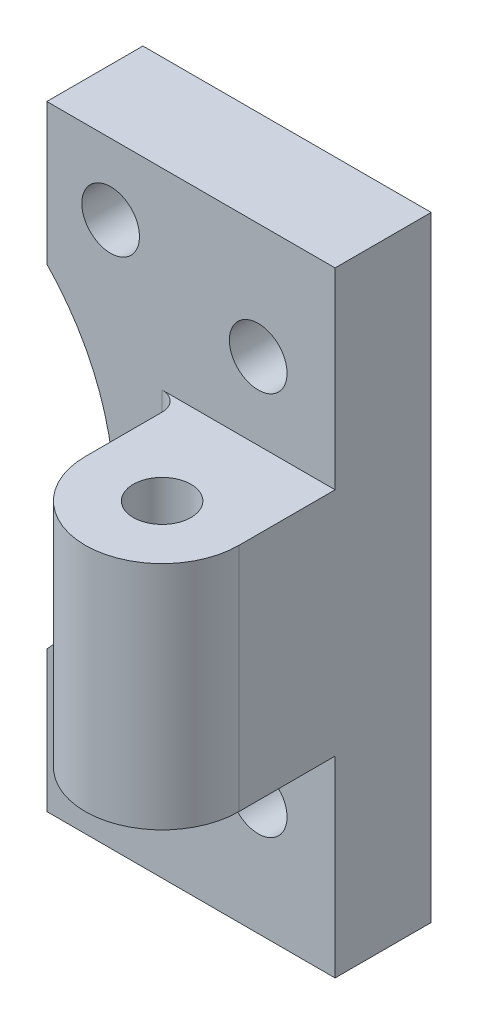
ISO-10303-21;
HEADER;
FILE_DESCRIPTION(('STEP AP214'),'2;1');
FILE_NAME('part.step','',(''),(''),'','','');
FILE_SCHEMA(('AUTOMOTIVE_DESIGN { 1 0 10303 214 1 1 1 1 }'));
ENDSEC;
DATA;
#1=APPLICATION_CONTEXT('core data for automotive mechanical design processes');
#2=APPLICATION_PROTOCOL_DEFINITION('international standard','automotive_design',2000,#1);
#3=PRODUCT_CONTEXT('',#1,'mechanical');
#4=PRODUCT('Part','Part','',(#3));
#5=PRODUCT_RELATED_PRODUCT_CATEGORY('part','',(#4));
#6=PRODUCT_DEFINITION_FORMATION('','',#4);
#7=PRODUCT_DEFINITION_CONTEXT('part definition',#1,'design');
#8=PRODUCT_DEFINITION('design','',#6,#7);
#9=PRODUCT_DEFINITION_SHAPE('','',#8);
#10=(LENGTH_UNIT() NAMED_UNIT(*) SI_UNIT(.MILLI.,.METRE.));
#11=(NAMED_UNIT(*) PLANE_ANGLE_UNIT() SI_UNIT($,.RADIAN.));
#12=(NAMED_UNIT(*) SI_UNIT($,.STERADIAN.) SOLID_ANGLE_UNIT());
#13=UNCERTAINTY_MEASURE_WITH_UNIT(LENGTH_MEASURE(1.E-05),#10,'distance_accuracy_value','');
#14=(GEOMETRIC_REPRESENTATION_CONTEXT(3) GLOBAL_UNCERTAINTY_ASSIGNED_CONTEXT((#13)) GLOBAL_UNIT_ASSIGNED_CONTEXT((#10,
#11,#12)) REPRESENTATION_CONTEXT('',''));
#15=CARTESIAN_POINT('',(0.,0.,0.));
#16=DIRECTION('',(0.,0.,1.));
#17=DIRECTION('',(1.,0.,0.));
#18=AXIS2_PLACEMENT_3D('',#15,#16,#17);
#19=CARTESIAN_POINT('',(15.875,-4.7625,7.9375));
#20=DIRECTION('',(0.,-1.,0.));
#21=DIRECTION('',(1.,0.,0.));
#22=AXIS2_PLACEMENT_3D('',#19,#20,#21);
#23=CYLINDRICAL_SURFACE('',#22,3.175);
#24=DIRECTION('',(0.,-1.,0.));
#25=VECTOR('',#24,1.);
#26=CARTESIAN_POINT('',(12.7,4.7625,7.9375));
#27=LINE('',#26,#25);
#28=CARTESIAN_POINT('',(12.7,-4.7625,7.9375));
#29=VERTEX_POINT('',#28);
#30=CARTESIAN_POINT('',(12.7,4.7625,7.9375));
#31=VERTEX_POINT('',#30);
#32=EDGE_CURVE('E182',#29,#31,#27,.F.);
#33=ORIENTED_EDGE('',*,*,#32,.F.);
#34=CARTESIAN_POINT('',(15.875,-4.7625,7.9375));
#35=DIRECTION('',(0.,1.,0.));
#36=DIRECTION('',(-1.,0.,0.));
#37=AXIS2_PLACEMENT_3D('',#34,#35,#36);
#38=CIRCLE('',#37,3.175);
#39=CARTESIAN_POINT('',(19.05,-4.7625,7.9375));
#40=VERTEX_POINT('',#39);
#41=EDGE_CURVE('E44',#40,#29,#38,.F.);
#42=ORIENTED_EDGE('',*,*,#41,.F.);
#43=DIRECTION('',(0.,-1.,0.));
#44=VECTOR('',#43,1.);
#45=CARTESIAN_POINT('',(19.05,12.7,7.9375));
#46=LINE('',#45,#44);
#47=CARTESIAN_POINT('',(19.05,4.7625,7.9375));
#48=VERTEX_POINT('',#47);
#49=EDGE_CURVE('E185',#48,#40,#46,.T.);
#50=ORIENTED_EDGE('',*,*,#49,.F.);
#51=CARTESIAN_POINT('',(15.875,4.7625,7.9375));
#52=DIRECTION('',(0.,-1.,0.));
#53=DIRECTION('',(1.,0.,0.));
#54=AXIS2_PLACEMENT_3D('',#51,#52,#53);
#55=CIRCLE('',#54,3.175);
#56=EDGE_CURVE('E11',#31,#48,#55,.F.);
#57=ORIENTED_EDGE('',*,*,#56,.F.);
#58=EDGE_LOOP('',(#33,#42,#50,#57));
#59=FACE_BOUND('',#58,.T.);
#60=ADVANCED_FACE('F36',(#59),#23,.T.);
#61=CARTESIAN_POINT('',(0.,0.,3.96875));
#62=DIRECTION('',(0.,0.,-1.));
#63=DIRECTION('',(-1.,0.,0.));
#64=AXIS2_PLACEMENT_3D('',#61,#62,#63);
#65=PLANE('',#64);
#66=CARTESIAN_POINT('',(9.779,9.779,3.96875));
#67=DIRECTION('',(0.,0.,-1.));
#68=DIRECTION('',(-1.,0.,0.));
#69=AXIS2_PLACEMENT_3D('',#66,#67,#68);
#70=CIRCLE('',#69,1.19126);
#71=CARTESIAN_POINT('',(8.58774,9.779,3.96875));
#72=VERTEX_POINT('',#71);
#73=EDGE_CURVE('E259',#72,#72,#70,.T.);
#74=ORIENTED_EDGE('',*,*,#73,.T.);
#75=EDGE_LOOP('',(#74));
#76=FACE_BOUND('',#75,.T.);
#77=CARTESIAN_POINT('',(9.779,-9.779,3.96875));
#78=DIRECTION('',(0.,0.,-1.));
#79=DIRECTION('',(-1.,0.,0.));
#80=AXIS2_PLACEMENT_3D('',#77,#78,#79);
#81=CIRCLE('',#80,1.19126);
#82=CARTESIAN_POINT('',(8.58774,-9.779,3.96875));
#83=VERTEX_POINT('',#82);
#84=EDGE_CURVE('E253',#83,#83,#81,.T.);
#85=ORIENTED_EDGE('',*,*,#84,.T.);
#86=EDGE_LOOP('',(#85));
#87=FACE_BOUND('',#86,.T.);
#88=CARTESIAN_POINT('',(15.875,7.9375,3.96875));
#89=DIRECTION('',(0.,0.,-1.));
#90=DIRECTION('',(-1.,0.,0.));
#91=AXIS2_PLACEMENT_3D('',#88,#89,#90);
#92=CIRCLE('',#91,1.19126);
#93=CARTESIAN_POINT('',(14.68374,7.9375,3.96875));
#94=VERTEX_POINT('',#93);
#95=EDGE_CURVE('E247',#94,#94,#92,.T.);
#96=ORIENTED_EDGE('',*,*,#95,.T.);
#97=EDGE_LOOP('',(#96));
#98=FACE_BOUND('',#97,.T.);
#99=CARTESIAN_POINT('',(15.875,-7.9375,3.96875));
#100=DIRECTION('',(0.,0.,-1.));
#101=DIRECTION('',(-1.,0.,0.));
#102=AXIS2_PLACEMENT_3D('',#99,#100,#101);
#103=CIRCLE('',#102,1.19126);
#104=CARTESIAN_POINT('',(14.68374,-7.9375,3.96875));
#105=VERTEX_POINT('',#104);
#106=EDGE_CURVE('E236',#105,#105,#103,.T.);
#107=ORIENTED_EDGE('',*,*,#106,.T.);
#108=EDGE_LOOP('',(#107));
#109=FACE_BOUND('',#108,.T.);
#110=DIRECTION('',(1.,0.,0.));
#111=VECTOR('',#110,1.);
#112=CARTESIAN_POINT('',(19.05,-4.7625,3.96875));
#113=LINE('',#112,#111);
#114=CARTESIAN_POINT('',(11.90625,-4.7625,3.96875));
#115=VERTEX_POINT('',#114);
#116=CARTESIAN_POINT('',(19.05,-4.7625,3.96875));
#117=VERTEX_POINT('',#116);
#118=EDGE_CURVE('E201',#115,#117,#113,.T.);
#119=ORIENTED_EDGE('',*,*,#118,.F.);
#120=DIRECTION('',(0.,-1.,0.));
#121=VECTOR('',#120,1.);
#122=CARTESIAN_POINT('',(11.90625,4.7625,3.96875));
#123=LINE('',#122,#121);
#124=CARTESIAN_POINT('',(11.90625,4.7625,3.96875));
#125=VERTEX_POINT('',#124);
#126=EDGE_CURVE('E173',#115,#125,#123,.F.);
#127=ORIENTED_EDGE('',*,*,#126,.T.);
#128=DIRECTION('',(-1.,0.,0.));
#129=VECTOR('',#128,1.);
#130=CARTESIAN_POINT('',(19.05,4.7625,3.96875));
#131=LINE('',#130,#129);
#132=CARTESIAN_POINT('',(19.05,4.7625,3.96875));
#133=VERTEX_POINT('',#132);
#134=EDGE_CURVE('E223',#133,#125,#131,.T.);
#135=ORIENTED_EDGE('',*,*,#134,.F.);
#136=DIRECTION('',(0.,1.,0.));
#137=VECTOR('',#136,1.);
#138=CARTESIAN_POINT('',(19.05,12.7,3.96875));
#139=LINE('',#138,#137);
#140=CARTESIAN_POINT('',(19.05,12.7,3.96875));
#141=VERTEX_POINT('',#140);
#142=EDGE_CURVE('E211',#133,#141,#139,.T.);
#143=ORIENTED_EDGE('',*,*,#142,.T.);
#144=DIRECTION('',(-1.,0.,0.));
#145=VECTOR('',#144,1.);
#146=CARTESIAN_POINT('',(19.05,12.7,3.96875));
#147=LINE('',#146,#145);
#148=CARTESIAN_POINT('',(7.14375,12.7,3.96875));
#149=VERTEX_POINT('',#148);
#150=EDGE_CURVE('E149',#141,#149,#147,.T.);
#151=ORIENTED_EDGE('',*,*,#150,.T.);
#152=DIRECTION('',(0.,1.,0.));
#153=VECTOR('',#152,1.);
#154=CARTESIAN_POINT('',(7.14375,12.7,3.96875));
#155=LINE('',#154,#153);
#156=CARTESIAN_POINT('',(7.14375,6.88552390549368,3.96875));
#157=VERTEX_POINT('',#156);
#158=EDGE_CURVE('E205',#157,#149,#155,.T.);
#159=ORIENTED_EDGE('',*,*,#158,.F.);
#160=CARTESIAN_POINT('',(0.,0.,3.96875));
#161=DIRECTION('',(0.,0.,1.));
#162=DIRECTION('',(1.,0.,0.));
#163=AXIS2_PLACEMENT_3D('',#160,#161,#162);
#164=CIRCLE('',#163,9.921875);
#165=CARTESIAN_POINT('',(7.14375,-6.88552390549368,3.96875));
#166=VERTEX_POINT('',#165);
#167=EDGE_CURVE('E142',#166,#157,#164,.T.);
#168=ORIENTED_EDGE('',*,*,#167,.F.);
#169=CARTESIAN_POINT('',(7.14375,-12.7,3.96875));
#170=VERTEX_POINT('',#169);
#171=EDGE_CURVE('E207',#170,#166,#155,.T.);
#172=ORIENTED_EDGE('',*,*,#171,.F.);
#173=DIRECTION('',(1.,0.,0.));
#174=VECTOR('',#173,1.);
#175=CARTESIAN_POINT('',(19.05,-12.7,3.96875));
#176=LINE('',#175,#174);
#177=CARTESIAN_POINT('',(19.05,-12.7,3.96875));
#178=VERTEX_POINT('',#177);
#179=EDGE_CURVE('E134',#170,#178,#176,.T.);
#180=ORIENTED_EDGE('',*,*,#179,.T.);
#181=EDGE_CURVE('E212',#178,#117,#139,.T.);
#182=ORIENTED_EDGE('',*,*,#181,.T.);
#183=EDGE_LOOP('',(#119,#127,#135,#143,#151,#159,#168,#172,#180,#182));
#184=FACE_BOUND('',#183,.T.);
#185=ADVANCED_FACE('F220',(#76,#87,#98,#109,#184),#65,.F.);
#186=CARTESIAN_POINT('',(19.05,-12.7,3.96875));
#187=DIRECTION('',(0.,1.,0.));
#188=DIRECTION('',(-1.,0.,0.));
#189=AXIS2_PLACEMENT_3D('',#186,#187,#188);
#190=PLANE('',#189);
#191=ORIENTED_EDGE('',*,*,#179,.F.);
#192=DIRECTION('',(0.,0.,1.));
#193=VECTOR('',#192,1.);
#194=CARTESIAN_POINT('',(7.14375,-12.7,0.));
#195=LINE('',#194,#193);
#196=CARTESIAN_POINT('',(7.14375,-12.7,0.));
#197=VERTEX_POINT('',#196);
#198=EDGE_CURVE('E118',#197,#170,#195,.T.);
#199=ORIENTED_EDGE('',*,*,#198,.F.);
#200=DIRECTION('',(1.,0.,0.));
#201=VECTOR('',#200,1.);
#202=CARTESIAN_POINT('',(19.05,-12.7,0.));
#203=LINE('',#202,#201);
#204=CARTESIAN_POINT('',(19.05,-12.7,0.));
#205=VERTEX_POINT('',#204);
#206=EDGE_CURVE('E132',#197,#205,#203,.T.);
#207=ORIENTED_EDGE('',*,*,#206,.T.);
#208=DIRECTION('',(0.,0.,-1.));
#209=VECTOR('',#208,1.);
#210=CARTESIAN_POINT('',(19.05,-12.7,3.96875));
#211=LINE('',#210,#209);
#212=EDGE_CURVE('E157',#178,#205,#211,.T.);
#213=ORIENTED_EDGE('',*,*,#212,.F.);
#214=EDGE_LOOP('',(#191,#199,#207,#213));
#215=FACE_BOUND('',#214,.T.);
#216=ADVANCED_FACE('F130',(#215),#190,.F.);
#217=CARTESIAN_POINT('',(19.05,12.7,3.96875));
#218=DIRECTION('',(-1.,0.,0.));
#219=DIRECTION('',(0.,-1.,0.));
#220=AXIS2_PLACEMENT_3D('',#217,#218,#219);
#221=PLANE('',#220);
#222=DIRECTION('',(0.,0.,-1.));
#223=VECTOR('',#222,1.);
#224=CARTESIAN_POINT('',(19.05,4.7625,11.1125));
#225=LINE('',#224,#223);
#226=EDGE_CURVE('E199',#48,#133,#225,.T.);
#227=ORIENTED_EDGE('',*,*,#226,.F.);
#228=ORIENTED_EDGE('',*,*,#49,.T.);
#229=DIRECTION('',(0.,0.,-1.));
#230=VECTOR('',#229,1.);
#231=CARTESIAN_POINT('',(19.05,-4.7625,11.1125));
#232=LINE('',#231,#230);
#233=EDGE_CURVE('E193',#40,#117,#232,.T.);
#234=ORIENTED_EDGE('',*,*,#233,.T.);
#235=ORIENTED_EDGE('',*,*,#181,.F.);
#236=ORIENTED_EDGE('',*,*,#212,.T.);
#237=DIRECTION('',(0.,1.,0.));
#238=VECTOR('',#237,1.);
#239=CARTESIAN_POINT('',(19.05,12.7,0.));
#240=LINE('',#239,#238);
#241=CARTESIAN_POINT('',(19.05,12.7,0.));
#242=VERTEX_POINT('',#241);
#243=EDGE_CURVE('E141',#205,#242,#240,.T.);
#244=ORIENTED_EDGE('',*,*,#243,.T.);
#245=DIRECTION('',(0.,0.,-1.));
#246=VECTOR('',#245,1.);
#247=CARTESIAN_POINT('',(19.05,12.7,3.96875));
#248=LINE('',#247,#246);
#249=EDGE_CURVE('E154',#141,#242,#248,.T.);
#250=ORIENTED_EDGE('',*,*,#249,.F.);
#251=ORIENTED_EDGE('',*,*,#142,.F.);
#252=EDGE_LOOP('',(#227,#228,#234,#235,#236,#244,#250,#251));
#253=FACE_BOUND('',#252,.T.);
#254=ADVANCED_FACE('F226',(#253),#221,.F.);
#255=CARTESIAN_POINT('',(19.05,12.7,3.96875));
#256=DIRECTION('',(0.,-1.,0.));
#257=DIRECTION('',(1.,0.,0.));
#258=AXIS2_PLACEMENT_3D('',#255,#256,#257);
#259=PLANE('',#258);
#260=DIRECTION('',(-1.,0.,0.));
#261=VECTOR('',#260,1.);
#262=CARTESIAN_POINT('',(19.05,12.7,0.));
#263=LINE('',#262,#261);
#264=CARTESIAN_POINT('',(7.14375,12.7,0.));
#265=VERTEX_POINT('',#264);
#266=EDGE_CURVE('E144',#242,#265,#263,.T.);
#267=ORIENTED_EDGE('',*,*,#266,.T.);
#268=DIRECTION('',(0.,0.,1.));
#269=VECTOR('',#268,1.);
#270=CARTESIAN_POINT('',(7.14375,12.7,0.));
#271=LINE('',#270,#269);
#272=EDGE_CURVE('E135',#265,#149,#271,.T.);
#273=ORIENTED_EDGE('',*,*,#272,.T.);
#274=ORIENTED_EDGE('',*,*,#150,.F.);
#275=ORIENTED_EDGE('',*,*,#249,.T.);
#276=EDGE_LOOP('',(#267,#273,#274,#275));
#277=FACE_BOUND('',#276,.T.);
#278=ADVANCED_FACE('F228',(#277),#259,.F.);
#279=CARTESIAN_POINT('',(0.,0.,0.));
#280=DIRECTION('',(0.,0.,-1.));
#281=DIRECTION('',(-1.,0.,0.));
#282=AXIS2_PLACEMENT_3D('',#279,#280,#281);
#283=PLANE('',#282);
#284=CARTESIAN_POINT('',(9.779,9.779,0.));
#285=DIRECTION('',(0.,0.,-1.));
#286=DIRECTION('',(-1.,0.,0.));
#287=AXIS2_PLACEMENT_3D('',#284,#285,#286);
#288=CIRCLE('',#287,1.19126);
#289=CARTESIAN_POINT('',(8.58774,9.779,0.));
#290=VERTEX_POINT('',#289);
#291=EDGE_CURVE('E262',#290,#290,#288,.T.);
#292=ORIENTED_EDGE('',*,*,#291,.F.);
#293=EDGE_LOOP('',(#292));
#294=FACE_BOUND('',#293,.T.);
#295=CARTESIAN_POINT('',(9.779,-9.779,0.));
#296=DIRECTION('',(0.,0.,-1.));
#297=DIRECTION('',(-1.,0.,0.));
#298=AXIS2_PLACEMENT_3D('',#295,#296,#297);
#299=CIRCLE('',#298,1.19126);
#300=CARTESIAN_POINT('',(8.58774,-9.779,0.));
#301=VERTEX_POINT('',#300);
#302=EDGE_CURVE('E256',#301,#301,#299,.T.);
#303=ORIENTED_EDGE('',*,*,#302,.F.);
#304=EDGE_LOOP('',(#303));
#305=FACE_BOUND('',#304,.T.);
#306=CARTESIAN_POINT('',(15.875,7.9375,0.));
#307=DIRECTION('',(0.,0.,-1.));
#308=DIRECTION('',(-1.,0.,0.));
#309=AXIS2_PLACEMENT_3D('',#306,#307,#308);
#310=CIRCLE('',#309,1.19126);
#311=CARTESIAN_POINT('',(14.68374,7.9375,0.));
#312=VERTEX_POINT('',#311);
#313=EDGE_CURVE('E250',#312,#312,#310,.T.);
#314=ORIENTED_EDGE('',*,*,#313,.F.);
#315=EDGE_LOOP('',(#314));
#316=FACE_BOUND('',#315,.T.);
#317=CARTESIAN_POINT('',(15.875,-7.9375,0.));
#318=DIRECTION('',(0.,0.,-1.));
#319=DIRECTION('',(-1.,0.,0.));
#320=AXIS2_PLACEMENT_3D('',#317,#318,#319);
#321=CIRCLE('',#320,1.19126);
#322=CARTESIAN_POINT('',(14.68374,-7.9375,0.));
#323=VERTEX_POINT('',#322);
#324=EDGE_CURVE('E244',#323,#323,#321,.T.);
#325=ORIENTED_EDGE('',*,*,#324,.F.);
#326=EDGE_LOOP('',(#325));
#327=FACE_BOUND('',#326,.T.);
#328=DIRECTION('',(0.,1.,0.));
#329=VECTOR('',#328,1.);
#330=CARTESIAN_POINT('',(7.14375,12.7,0.));
#331=LINE('',#330,#329);
#332=CARTESIAN_POINT('',(7.14375,6.88552390549368,0.));
#333=VERTEX_POINT('',#332);
#334=EDGE_CURVE('E126',#333,#265,#331,.T.);
#335=ORIENTED_EDGE('',*,*,#334,.T.);
#336=ORIENTED_EDGE('',*,*,#266,.F.);
#337=ORIENTED_EDGE('',*,*,#243,.F.);
#338=ORIENTED_EDGE('',*,*,#206,.F.);
#339=CARTESIAN_POINT('',(7.14375,-6.88552390549368,0.));
#340=VERTEX_POINT('',#339);
#341=EDGE_CURVE('E115',#197,#340,#331,.T.);
#342=ORIENTED_EDGE('',*,*,#341,.T.);
#343=CARTESIAN_POINT('',(0.,0.,0.));
#344=DIRECTION('',(0.,0.,-1.));
#345=DIRECTION('',(-1.,0.,0.));
#346=AXIS2_PLACEMENT_3D('',#343,#344,#345);
#347=CIRCLE('',#346,9.921875);
#348=EDGE_CURVE('E159',#333,#340,#347,.T.);
#349=ORIENTED_EDGE('',*,*,#348,.F.);
#350=EDGE_LOOP('',(#335,#336,#337,#338,#342,#349));
#351=FACE_BOUND('',#350,.T.);
#352=ADVANCED_FACE('F139',(#294,#305,#316,#327,#351),#283,.T.);
#353=CARTESIAN_POINT('',(0.,0.,0.));
#354=DIRECTION('',(0.,0.,1.));
#355=DIRECTION('',(1.,0.,0.));
#356=AXIS2_PLACEMENT_3D('',#353,#354,#355);
#357=CYLINDRICAL_SURFACE('',#356,9.921875);
#358=ORIENTED_EDGE('',*,*,#167,.T.);
#359=DIRECTION('',(0.,0.,1.));
#360=VECTOR('',#359,1.);
#361=CARTESIAN_POINT('',(7.14375,6.88552390549368,0.));
#362=LINE('',#361,#360);
#363=EDGE_CURVE('E162',#157,#333,#362,.F.);
#364=ORIENTED_EDGE('',*,*,#363,.T.);
#365=ORIENTED_EDGE('',*,*,#348,.T.);
#366=DIRECTION('',(0.,0.,1.));
#367=VECTOR('',#366,1.);
#368=CARTESIAN_POINT('',(7.14375,-6.88552390549368,0.));
#369=LINE('',#368,#367);
#370=EDGE_CURVE('E121',#340,#166,#369,.T.);
#371=ORIENTED_EDGE('',*,*,#370,.T.);
#372=EDGE_LOOP('',(#358,#364,#365,#371));
#373=FACE_BOUND('',#372,.T.);
#374=ADVANCED_FACE('F232',(#373),#357,.F.);
#375=CARTESIAN_POINT('',(7.14375,12.7,0.));
#376=DIRECTION('',(1.,0.,0.));
#377=DIRECTION('',(0.,1.,0.));
#378=AXIS2_PLACEMENT_3D('',#375,#376,#377);
#379=PLANE('',#378);
#380=ORIENTED_EDGE('',*,*,#341,.F.);
#381=ORIENTED_EDGE('',*,*,#198,.T.);
#382=ORIENTED_EDGE('',*,*,#171,.T.);
#383=ORIENTED_EDGE('',*,*,#370,.F.);
#384=EDGE_LOOP('',(#380,#381,#382,#383));
#385=FACE_BOUND('',#384,.T.);
#386=ADVANCED_FACE('F117',(#385),#379,.F.);
#387=ORIENTED_EDGE('',*,*,#158,.T.);
#388=ORIENTED_EDGE('',*,*,#272,.F.);
#389=ORIENTED_EDGE('',*,*,#334,.F.);
#390=ORIENTED_EDGE('',*,*,#363,.F.);
#391=EDGE_LOOP('',(#387,#388,#389,#390));
#392=FACE_BOUND('',#391,.T.);
#393=ADVANCED_FACE('F230',(#392),#379,.F.);
#394=CARTESIAN_POINT('',(19.05,4.7625,11.1125));
#395=DIRECTION('',(0.,-1.,0.));
#396=DIRECTION('',(1.,0.,0.));
#397=AXIS2_PLACEMENT_3D('',#394,#395,#396);
#398=PLANE('',#397);
#399=CARTESIAN_POINT('',(15.875,4.7625,7.9375));
#400=DIRECTION('',(0.,1.,0.));
#401=DIRECTION('',(0.,0.,1.));
#402=AXIS2_PLACEMENT_3D('',#399,#400,#401);
#403=CIRCLE('',#402,1.19125999999999);
#404=CARTESIAN_POINT('',(15.875,4.7625,9.12875999999999));
#405=VERTEX_POINT('',#404);
#406=EDGE_CURVE('E169',#405,#405,#403,.T.);
#407=ORIENTED_EDGE('',*,*,#406,.F.);
#408=EDGE_LOOP('',(#407));
#409=FACE_BOUND('',#408,.T.);
#410=DIRECTION('',(0.,0.,-1.));
#411=VECTOR('',#410,1.);
#412=CARTESIAN_POINT('',(12.7,4.7625,11.1125));
#413=LINE('',#412,#411);
#414=CARTESIAN_POINT('',(12.7,4.7625,4.7625));
#415=VERTEX_POINT('',#414);
#416=EDGE_CURVE('E197',#31,#415,#413,.T.);
#417=ORIENTED_EDGE('',*,*,#416,.F.);
#418=ORIENTED_EDGE('',*,*,#56,.T.);
#419=ORIENTED_EDGE('',*,*,#226,.T.);
#420=ORIENTED_EDGE('',*,*,#134,.T.);
#421=CARTESIAN_POINT('',(11.90625,4.7625,4.7625));
#422=DIRECTION('',(0.,-1.,0.));
#423=DIRECTION('',(1.,0.,0.));
#424=AXIS2_PLACEMENT_3D('',#421,#422,#423);
#425=CIRCLE('',#424,0.79375);
#426=EDGE_CURVE('E179',#125,#415,#425,.T.);
#427=ORIENTED_EDGE('',*,*,#426,.T.);
#428=EDGE_LOOP('',(#417,#418,#419,#420,#427));
#429=FACE_BOUND('',#428,.T.);
#430=ADVANCED_FACE('F234',(#409,#429),#398,.F.);
#431=CARTESIAN_POINT('',(12.7,4.7625,11.1125));
#432=DIRECTION('',(1.,0.,0.));
#433=DIRECTION('',(0.,1.,0.));
#434=AXIS2_PLACEMENT_3D('',#431,#432,#433);
#435=PLANE('',#434);
#436=DIRECTION('',(0.,0.,-1.));
#437=VECTOR('',#436,1.);
#438=CARTESIAN_POINT('',(12.7,-4.7625,11.1125));
#439=LINE('',#438,#437);
#440=CARTESIAN_POINT('',(12.7,-4.7625,4.7625));
#441=VERTEX_POINT('',#440);
#442=EDGE_CURVE('E190',#29,#441,#439,.T.);
#443=ORIENTED_EDGE('',*,*,#442,.F.);
#444=ORIENTED_EDGE('',*,*,#32,.T.);
#445=ORIENTED_EDGE('',*,*,#416,.T.);
#446=DIRECTION('',(0.,-1.,0.));
#447=VECTOR('',#446,1.);
#448=CARTESIAN_POINT('',(12.7,-4.7625,4.7625));
#449=LINE('',#448,#447);
#450=EDGE_CURVE('E165',#415,#441,#449,.T.);
#451=ORIENTED_EDGE('',*,*,#450,.T.);
#452=EDGE_LOOP('',(#443,#444,#445,#451));
#453=FACE_BOUND('',#452,.T.);
#454=ADVANCED_FACE('F195',(#453),#435,.F.);
#455=CARTESIAN_POINT('',(19.05,-4.7625,11.1125));
#456=DIRECTION('',(0.,1.,0.));
#457=DIRECTION('',(-1.,0.,0.));
#458=AXIS2_PLACEMENT_3D('',#455,#456,#457);
#459=PLANE('',#458);
#460=CARTESIAN_POINT('',(15.875,-4.7625,7.9375));
#461=DIRECTION('',(0.,-1.,0.));
#462=DIRECTION('',(0.,0.,-1.));
#463=AXIS2_PLACEMENT_3D('',#460,#461,#462);
#464=CIRCLE('',#463,1.19125999999999);
#465=CARTESIAN_POINT('',(15.875,-4.7625,6.74624000000001));
#466=VERTEX_POINT('',#465);
#467=EDGE_CURVE('E272',#466,#466,#464,.T.);
#468=ORIENTED_EDGE('',*,*,#467,.F.);
#469=EDGE_LOOP('',(#468));
#470=FACE_BOUND('',#469,.T.);
#471=ORIENTED_EDGE('',*,*,#233,.F.);
#472=ORIENTED_EDGE('',*,*,#41,.T.);
#473=ORIENTED_EDGE('',*,*,#442,.T.);
#474=CARTESIAN_POINT('',(11.90625,-4.7625,4.7625));
#475=DIRECTION('',(0.,1.,0.));
#476=DIRECTION('',(-1.,0.,0.));
#477=AXIS2_PLACEMENT_3D('',#474,#475,#476);
#478=CIRCLE('',#477,0.79375);
#479=EDGE_CURVE('E176',#441,#115,#478,.T.);
#480=ORIENTED_EDGE('',*,*,#479,.T.);
#481=ORIENTED_EDGE('',*,*,#118,.T.);
#482=EDGE_LOOP('',(#471,#472,#473,#480,#481));
#483=FACE_BOUND('',#482,.T.);
#484=ADVANCED_FACE('F188',(#470,#483),#459,.F.);
#485=CARTESIAN_POINT('',(15.875,-7.9375,0.));
#486=DIRECTION('',(0.,0.,-1.));
#487=DIRECTION('',(-1.,0.,0.));
#488=AXIS2_PLACEMENT_3D('',#485,#486,#487);
#489=CYLINDRICAL_SURFACE('',#488,1.19126);
#490=ORIENTED_EDGE('',*,*,#324,.T.);
#491=EDGE_LOOP('',(#490));
#492=FACE_BOUND('',#491,.T.);
#493=ORIENTED_EDGE('',*,*,#106,.F.);
#494=EDGE_LOOP('',(#493));
#495=FACE_BOUND('',#494,.T.);
#496=ADVANCED_FACE('F279',(#492,#495),#489,.F.);
#497=CARTESIAN_POINT('',(15.875,7.9375,0.));
#498=DIRECTION('',(0.,0.,-1.));
#499=DIRECTION('',(-1.,0.,0.));
#500=AXIS2_PLACEMENT_3D('',#497,#498,#499);
#501=CYLINDRICAL_SURFACE('',#500,1.19126);
#502=ORIENTED_EDGE('',*,*,#313,.T.);
#503=EDGE_LOOP('',(#502));
#504=FACE_BOUND('',#503,.T.);
#505=ORIENTED_EDGE('',*,*,#95,.F.);
#506=EDGE_LOOP('',(#505));
#507=FACE_BOUND('',#506,.T.);
#508=ADVANCED_FACE('F285',(#504,#507),#501,.F.);
#509=CARTESIAN_POINT('',(9.779,-9.779,0.));
#510=DIRECTION('',(0.,0.,-1.));
#511=DIRECTION('',(-1.,0.,0.));
#512=AXIS2_PLACEMENT_3D('',#509,#510,#511);
#513=CYLINDRICAL_SURFACE('',#512,1.19126);
#514=ORIENTED_EDGE('',*,*,#302,.T.);
#515=EDGE_LOOP('',(#514));
#516=FACE_BOUND('',#515,.T.);
#517=ORIENTED_EDGE('',*,*,#84,.F.);
#518=EDGE_LOOP('',(#517));
#519=FACE_BOUND('',#518,.T.);
#520=ADVANCED_FACE('F334',(#516,#519),#513,.F.);
#521=CARTESIAN_POINT('',(9.779,9.779,0.));
#522=DIRECTION('',(0.,0.,-1.));
#523=DIRECTION('',(-1.,0.,0.));
#524=AXIS2_PLACEMENT_3D('',#521,#522,#523);
#525=CYLINDRICAL_SURFACE('',#524,1.19126);
#526=ORIENTED_EDGE('',*,*,#291,.T.);
#527=EDGE_LOOP('',(#526));
#528=FACE_BOUND('',#527,.T.);
#529=ORIENTED_EDGE('',*,*,#73,.F.);
#530=EDGE_LOOP('',(#529));
#531=FACE_BOUND('',#530,.T.);
#532=ADVANCED_FACE('F330',(#528,#531),#525,.F.);
#533=CARTESIAN_POINT('',(15.875,0.0254000000000027,7.9375));
#534=DIRECTION('',(0.,1.,0.));
#535=DIRECTION('',(0.,0.,1.));
#536=AXIS2_PLACEMENT_3D('',#533,#534,#535);
#537=CONICAL_SURFACE('',#536,1.19126,1.02974425867665);
#538=CARTESIAN_POINT('',(15.875,0.,7.9375));
#539=DIRECTION('',(0.,-1.,0.));
#540=DIRECTION('',(0.,0.,-1.));
#541=AXIS2_PLACEMENT_3D('',#538,#539,#540);
#542=CIRCLE('',#541,1.1489873011483);
#543=CARTESIAN_POINT('',(15.875,0.,6.7885126988517));
#544=VERTEX_POINT('',#543);
#545=EDGE_CURVE('E166',#544,#544,#542,.T.);
#546=ORIENTED_EDGE('',*,*,#545,.T.);
#547=EDGE_LOOP('',(#546));
#548=FACE_BOUND('',#547,.T.);
#549=CARTESIAN_POINT('',(15.875,0.0254000000000027,7.9375));
#550=DIRECTION('',(0.,1.,0.));
#551=DIRECTION('',(0.,0.,1.));
#552=AXIS2_PLACEMENT_3D('',#549,#550,#551);
#553=CIRCLE('',#552,1.19126);
#554=CARTESIAN_POINT('',(15.875,0.0254000000000027,9.12876));
#555=VERTEX_POINT('',#554);
#556=EDGE_CURVE('E265',#555,#555,#553,.T.);
#557=ORIENTED_EDGE('',*,*,#556,.T.);
#558=EDGE_LOOP('',(#557));
#559=FACE_BOUND('',#558,.T.);
#560=ADVANCED_FACE('F326',(#548,#559),#537,.F.);
#561=CARTESIAN_POINT('',(15.875,4.7625,7.9375));
#562=DIRECTION('',(0.,1.,0.));
#563=DIRECTION('',(0.,0.,1.));
#564=AXIS2_PLACEMENT_3D('',#561,#562,#563);
#565=CYLINDRICAL_SURFACE('',#564,1.19125999999999);
#566=ORIENTED_EDGE('',*,*,#556,.F.);
#567=EDGE_LOOP('',(#566));
#568=FACE_BOUND('',#567,.T.);
#569=ORIENTED_EDGE('',*,*,#406,.T.);
#570=EDGE_LOOP('',(#569));
#571=FACE_BOUND('',#570,.T.);
#572=ADVANCED_FACE('F319',(#568,#571),#565,.F.);
#573=CARTESIAN_POINT('',(15.875,-0.0253999999999975,7.9375));
#574=DIRECTION('',(0.,-1.,0.));
#575=DIRECTION('',(0.,0.,-1.));
#576=AXIS2_PLACEMENT_3D('',#573,#574,#575);
#577=CONICAL_SURFACE('',#576,1.19126,1.02974425867665);
#578=CARTESIAN_POINT('',(15.875,-0.0253999999999975,7.9375));
#579=DIRECTION('',(0.,-1.,0.));
#580=DIRECTION('',(0.,0.,-1.));
#581=AXIS2_PLACEMENT_3D('',#578,#579,#580);
#582=CIRCLE('',#581,1.19126);
#583=CARTESIAN_POINT('',(15.875,-0.0253999999999975,6.74624));
#584=VERTEX_POINT('',#583);
#585=EDGE_CURVE('E170',#584,#584,#582,.T.);
#586=ORIENTED_EDGE('',*,*,#585,.T.);
#587=EDGE_LOOP('',(#586));
#588=FACE_BOUND('',#587,.T.);
#589=ORIENTED_EDGE('',*,*,#545,.F.);
#590=EDGE_LOOP('',(#589));
#591=FACE_BOUND('',#590,.T.);
#592=ADVANCED_FACE('F313',(#588,#591),#577,.F.);
#593=CARTESIAN_POINT('',(15.875,-4.7625,7.9375));
#594=DIRECTION('',(0.,-1.,0.));
#595=DIRECTION('',(0.,0.,-1.));
#596=AXIS2_PLACEMENT_3D('',#593,#594,#595);
#597=CYLINDRICAL_SURFACE('',#596,1.19125999999999);
#598=ORIENTED_EDGE('',*,*,#585,.F.);
#599=EDGE_LOOP('',(#598));
#600=FACE_BOUND('',#599,.T.);
#601=ORIENTED_EDGE('',*,*,#467,.T.);
#602=EDGE_LOOP('',(#601));
#603=FACE_BOUND('',#602,.T.);
#604=ADVANCED_FACE('F276',(#600,#603),#597,.F.);
#605=CARTESIAN_POINT('',(11.90625,4.7625,4.7625));
#606=DIRECTION('',(0.,1.,0.));
#607=DIRECTION('',(-1.,0.,0.));
#608=AXIS2_PLACEMENT_3D('',#605,#606,#607);
#609=CYLINDRICAL_SURFACE('',#608,0.79375);
#610=ORIENTED_EDGE('',*,*,#426,.F.);
#611=ORIENTED_EDGE('',*,*,#126,.F.);
#612=ORIENTED_EDGE('',*,*,#479,.F.);
#613=ORIENTED_EDGE('',*,*,#450,.F.);
#614=EDGE_LOOP('',(#610,#611,#612,#613));
#615=FACE_BOUND('',#614,.T.);
#616=ADVANCED_FACE('F240',(#615),#609,.F.);
#617=CLOSED_SHELL('',(#60,#185,#216,#254,#278,#352,#374,#386,#393,#430,#454,#484,#496,#508,#520,
#532,#560,#572,#592,#604,#616));
#618=MANIFOLD_SOLID_BREP('B2',#617);
#619=ADVANCED_BREP_SHAPE_REPRESENTATION('',(#18,#618),#14);
#620=SHAPE_DEFINITION_REPRESENTATION(#9,#619);
ENDSEC;
END-ISO-10303-21;
